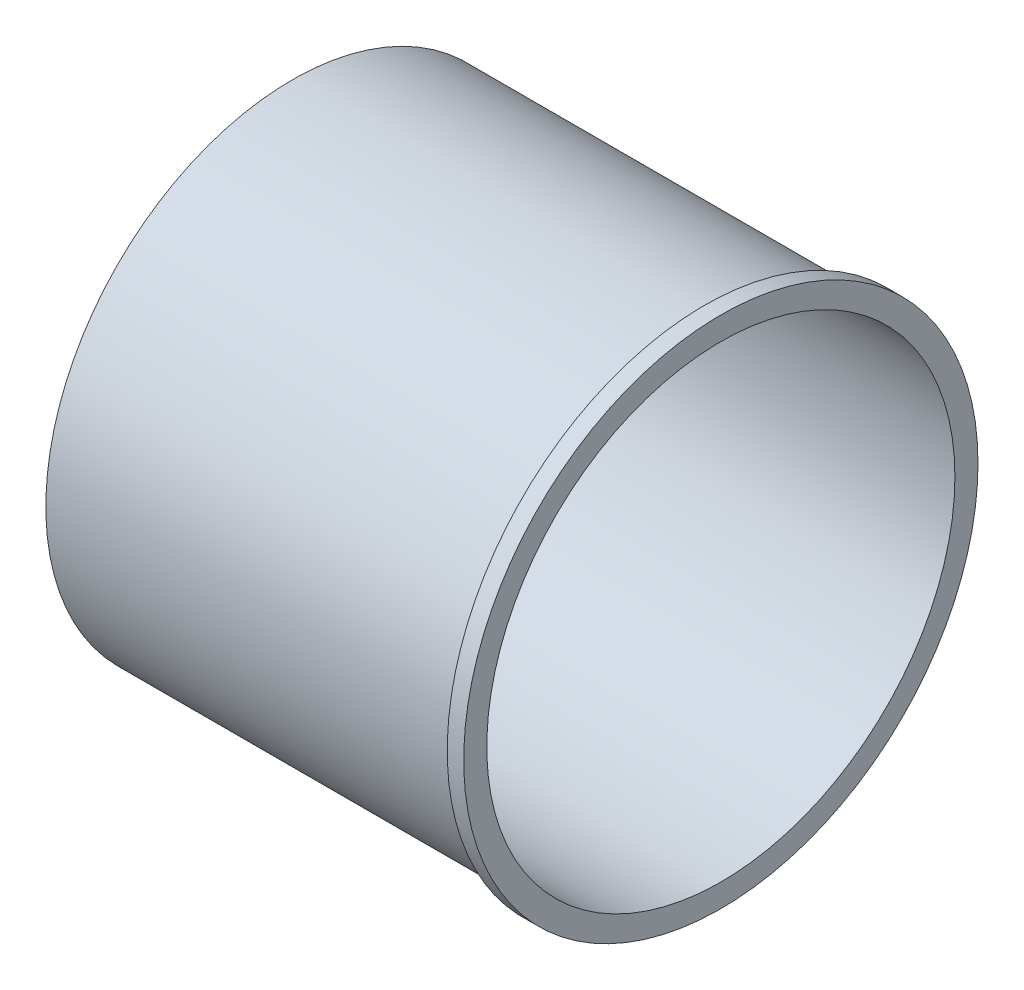
ISO-10303-21;
HEADER;
FILE_DESCRIPTION(('STEP AP214'),'2;1');
FILE_NAME('part.step','',(''),(''),'','','');
FILE_SCHEMA(('AUTOMOTIVE_DESIGN { 1 0 10303 214 1 1 1 1 }'));
ENDSEC;
DATA;
#1=APPLICATION_CONTEXT('core data for automotive mechanical design processes');
#2=APPLICATION_PROTOCOL_DEFINITION('international standard','automotive_design',2000,#1);
#3=PRODUCT_CONTEXT('',#1,'mechanical');
#4=PRODUCT('Part','Part','',(#3));
#5=PRODUCT_RELATED_PRODUCT_CATEGORY('part','',(#4));
#6=PRODUCT_DEFINITION_FORMATION('','',#4);
#7=PRODUCT_DEFINITION_CONTEXT('part definition',#1,'design');
#8=PRODUCT_DEFINITION('design','',#6,#7);
#9=PRODUCT_DEFINITION_SHAPE('','',#8);
#10=(LENGTH_UNIT() NAMED_UNIT(*) SI_UNIT(.MILLI.,.METRE.));
#11=(NAMED_UNIT(*) PLANE_ANGLE_UNIT() SI_UNIT($,.RADIAN.));
#12=(NAMED_UNIT(*) SI_UNIT($,.STERADIAN.) SOLID_ANGLE_UNIT());
#13=UNCERTAINTY_MEASURE_WITH_UNIT(LENGTH_MEASURE(1.E-05),#10,'distance_accuracy_value','');
#14=(GEOMETRIC_REPRESENTATION_CONTEXT(3) GLOBAL_UNCERTAINTY_ASSIGNED_CONTEXT((#13)) GLOBAL_UNIT_ASSIGNED_CONTEXT((#10,
#11,#12)) REPRESENTATION_CONTEXT('',''));
#15=CARTESIAN_POINT('',(0.,0.,0.));
#16=DIRECTION('',(0.,0.,1.));
#17=DIRECTION('',(1.,0.,0.));
#18=AXIS2_PLACEMENT_3D('',#15,#16,#17);
#19=CARTESIAN_POINT('',(0.,0.,0.));
#20=DIRECTION('',(1.,0.,0.));
#21=DIRECTION('',(0.,0.,-1.));
#22=AXIS2_PLACEMENT_3D('',#19,#20,#21);
#23=PLANE('',#22);
#24=CARTESIAN_POINT('',(0.,0.,0.));
#25=DIRECTION('',(1.,0.,0.));
#26=DIRECTION('',(0.,0.,-1.));
#27=AXIS2_PLACEMENT_3D('',#24,#25,#26);
#28=CIRCLE('',#27,37.973);
#29=CARTESIAN_POINT('',(0.,0.,-37.973));
#30=VERTEX_POINT('',#29);
#31=EDGE_CURVE('E47',#30,#30,#28,.T.);
#32=ORIENTED_EDGE('',*,*,#31,.F.);
#33=EDGE_LOOP('',(#32));
#34=FACE_BOUND('',#33,.T.);
#35=CARTESIAN_POINT('',(0.,0.,0.));
#36=DIRECTION('',(1.,0.,0.));
#37=DIRECTION('',(0.,0.,-1.));
#38=AXIS2_PLACEMENT_3D('',#35,#36,#37);
#39=CIRCLE('',#38,36.068);
#40=CARTESIAN_POINT('',(0.,0.,-36.068));
#41=VERTEX_POINT('',#40);
#42=EDGE_CURVE('E56',#41,#41,#39,.T.);
#43=ORIENTED_EDGE('',*,*,#42,.T.);
#44=EDGE_LOOP('',(#43));
#45=FACE_BOUND('',#44,.T.);
#46=ADVANCED_FACE('F43',(#34,#45),#23,.F.);
#47=CARTESIAN_POINT('',(63.5,0.,0.));
#48=DIRECTION('',(-1.,0.,0.));
#49=DIRECTION('',(0.,0.,1.));
#50=AXIS2_PLACEMENT_3D('',#47,#48,#49);
#51=CYLINDRICAL_SURFACE('',#50,37.973);
#52=CARTESIAN_POINT('',(63.5,0.,0.));
#53=DIRECTION('',(1.,0.,0.));
#54=DIRECTION('',(0.,0.,-1.));
#55=AXIS2_PLACEMENT_3D('',#52,#53,#54);
#56=CIRCLE('',#55,37.973);
#57=CARTESIAN_POINT('',(63.5,0.,-37.973));
#58=VERTEX_POINT('',#57);
#59=EDGE_CURVE('E10',#58,#58,#56,.T.);
#60=ORIENTED_EDGE('',*,*,#59,.F.);
#61=EDGE_LOOP('',(#60));
#62=FACE_BOUND('',#61,.T.);
#63=ORIENTED_EDGE('',*,*,#31,.T.);
#64=EDGE_LOOP('',(#63));
#65=FACE_BOUND('',#64,.T.);
#66=ADVANCED_FACE('F45',(#62,#65),#51,.T.);
#67=CARTESIAN_POINT('',(63.5,0.,0.));
#68=DIRECTION('',(-1.,0.,0.));
#69=DIRECTION('',(0.,0.,1.));
#70=AXIS2_PLACEMENT_3D('',#67,#68,#69);
#71=CYLINDRICAL_SURFACE('',#70,36.068);
#72=ORIENTED_EDGE('',*,*,#42,.F.);
#73=EDGE_LOOP('',(#72));
#74=FACE_BOUND('',#73,.T.);
#75=CARTESIAN_POINT('',(66.04,0.,0.));
#76=DIRECTION('',(1.,0.,0.));
#77=DIRECTION('',(0.,0.,-1.));
#78=AXIS2_PLACEMENT_3D('',#75,#76,#77);
#79=CIRCLE('',#78,36.068);
#80=CARTESIAN_POINT('',(66.04,0.,-36.068));
#81=VERTEX_POINT('',#80);
#82=EDGE_CURVE('E66',#81,#81,#79,.T.);
#83=ORIENTED_EDGE('',*,*,#82,.T.);
#84=EDGE_LOOP('',(#83));
#85=FACE_BOUND('',#84,.T.);
#86=ADVANCED_FACE('F74',(#74,#85),#71,.F.);
#87=CARTESIAN_POINT('',(66.04,0.,0.));
#88=DIRECTION('',(1.,0.,0.));
#89=DIRECTION('',(0.,0.,-1.));
#90=AXIS2_PLACEMENT_3D('',#87,#88,#89);
#91=PLANE('',#90);
#92=CARTESIAN_POINT('',(66.04,0.,0.));
#93=DIRECTION('',(1.,0.,0.));
#94=DIRECTION('',(0.,0.,-1.));
#95=AXIS2_PLACEMENT_3D('',#92,#93,#94);
#96=CIRCLE('',#95,39.624);
#97=CARTESIAN_POINT('',(66.04,0.,-39.624));
#98=VERTEX_POINT('',#97);
#99=EDGE_CURVE('E61',#98,#98,#96,.T.);
#100=ORIENTED_EDGE('',*,*,#99,.T.);
#101=EDGE_LOOP('',(#100));
#102=FACE_BOUND('',#101,.T.);
#103=ORIENTED_EDGE('',*,*,#82,.F.);
#104=EDGE_LOOP('',(#103));
#105=FACE_BOUND('',#104,.T.);
#106=ADVANCED_FACE('F76',(#102,#105),#91,.T.);
#107=CARTESIAN_POINT('',(63.5,0.,0.));
#108=DIRECTION('',(1.,0.,0.));
#109=DIRECTION('',(0.,0.,-1.));
#110=AXIS2_PLACEMENT_3D('',#107,#108,#109);
#111=PLANE('',#110);
#112=ORIENTED_EDGE('',*,*,#59,.T.);
#113=EDGE_LOOP('',(#112));
#114=FACE_BOUND('',#113,.T.);
#115=CARTESIAN_POINT('',(63.5,0.,0.));
#116=DIRECTION('',(1.,0.,0.));
#117=DIRECTION('',(0.,0.,-1.));
#118=AXIS2_PLACEMENT_3D('',#115,#116,#117);
#119=CIRCLE('',#118,39.624);
#120=CARTESIAN_POINT('',(63.5,0.,-39.624));
#121=VERTEX_POINT('',#120);
#122=EDGE_CURVE('E62',#121,#121,#119,.T.);
#123=ORIENTED_EDGE('',*,*,#122,.F.);
#124=EDGE_LOOP('',(#123));
#125=FACE_BOUND('',#124,.T.);
#126=ADVANCED_FACE('F78',(#114,#125),#111,.F.);
#127=CARTESIAN_POINT('',(66.04,0.,0.));
#128=DIRECTION('',(-1.,0.,0.));
#129=DIRECTION('',(0.,0.,1.));
#130=AXIS2_PLACEMENT_3D('',#127,#128,#129);
#131=CYLINDRICAL_SURFACE('',#130,39.624);
#132=ORIENTED_EDGE('',*,*,#99,.F.);
#133=EDGE_LOOP('',(#132));
#134=FACE_BOUND('',#133,.T.);
#135=ORIENTED_EDGE('',*,*,#122,.T.);
#136=EDGE_LOOP('',(#135));
#137=FACE_BOUND('',#136,.T.);
#138=ADVANCED_FACE('F85',(#134,#137),#131,.T.);
#139=CLOSED_SHELL('',(#46,#66,#86,#106,#126,#138));
#140=MANIFOLD_SOLID_BREP('B2',#139);
#141=ADVANCED_BREP_SHAPE_REPRESENTATION('',(#18,#140),#14);
#142=SHAPE_DEFINITION_REPRESENTATION(#9,#141);
ENDSEC;
END-ISO-10303-21;
